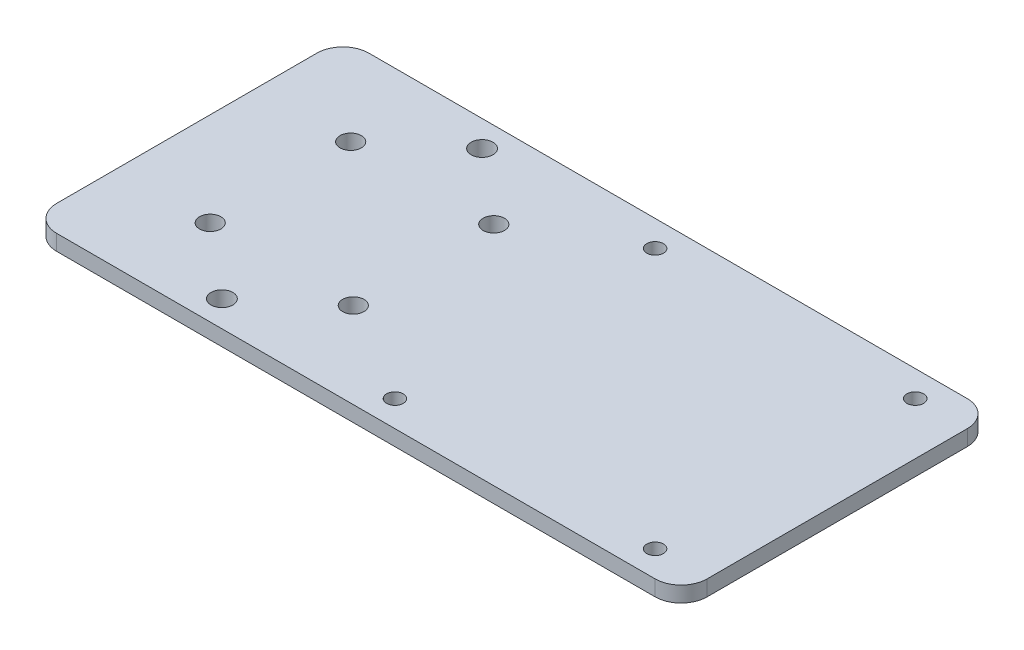
ISO-10303-21;
HEADER;
FILE_DESCRIPTION(('STEP AP214'),'2;1');
FILE_NAME('part.step','',(''),(''),'','','');
FILE_SCHEMA(('AUTOMOTIVE_DESIGN { 1 0 10303 214 1 1 1 1 }'));
ENDSEC;
DATA;
#1=APPLICATION_CONTEXT('core data for automotive mechanical design processes');
#2=APPLICATION_PROTOCOL_DEFINITION('international standard','automotive_design',2000,#1);
#3=PRODUCT_CONTEXT('',#1,'mechanical');
#4=PRODUCT('Part','Part','',(#3));
#5=PRODUCT_RELATED_PRODUCT_CATEGORY('part','',(#4));
#6=PRODUCT_DEFINITION_FORMATION('','',#4);
#7=PRODUCT_DEFINITION_CONTEXT('part definition',#1,'design');
#8=PRODUCT_DEFINITION('design','',#6,#7);
#9=PRODUCT_DEFINITION_SHAPE('','',#8);
#10=(LENGTH_UNIT() NAMED_UNIT(*) SI_UNIT(.MILLI.,.METRE.));
#11=(NAMED_UNIT(*) PLANE_ANGLE_UNIT() SI_UNIT($,.RADIAN.));
#12=(NAMED_UNIT(*) SI_UNIT($,.STERADIAN.) SOLID_ANGLE_UNIT());
#13=UNCERTAINTY_MEASURE_WITH_UNIT(LENGTH_MEASURE(1.E-05),#10,'distance_accuracy_value','');
#14=(GEOMETRIC_REPRESENTATION_CONTEXT(3) GLOBAL_UNCERTAINTY_ASSIGNED_CONTEXT((#13)) GLOBAL_UNIT_ASSIGNED_CONTEXT((#10,
#11,#12)) REPRESENTATION_CONTEXT('',''));
#15=CARTESIAN_POINT('',(0.,0.,0.));
#16=DIRECTION('',(0.,0.,1.));
#17=DIRECTION('',(1.,0.,0.));
#18=AXIS2_PLACEMENT_3D('',#15,#16,#17);
#19=CARTESIAN_POINT('',(-121.441364285791,3.,0.));
#20=DIRECTION('',(1.,0.,0.));
#21=DIRECTION('',(0.,0.,-1.));
#22=AXIS2_PLACEMENT_3D('',#19,#20,#21);
#23=PLANE('',#22);
#24=DIRECTION('',(0.,0.,1.));
#25=VECTOR('',#24,1.);
#26=CARTESIAN_POINT('',(-121.441364285791,3.,0.));
#27=LINE('',#26,#25);
#28=CARTESIAN_POINT('',(-121.441364285791,3.,-97.5));
#29=VERTEX_POINT('',#28);
#30=CARTESIAN_POINT('',(-121.441364285791,3.,-47.5));
#31=VERTEX_POINT('',#30);
#32=EDGE_CURVE('E128',#29,#31,#27,.T.);
#33=ORIENTED_EDGE('',*,*,#32,.T.);
#34=DIRECTION('',(0.,-1.,0.));
#35=VECTOR('',#34,1.);
#36=CARTESIAN_POINT('',(-121.441364285791,0.,-47.5));
#37=LINE('',#36,#35);
#38=CARTESIAN_POINT('',(-121.441364285791,0.,-47.5));
#39=VERTEX_POINT('',#38);
#40=EDGE_CURVE('E155',#31,#39,#37,.T.);
#41=ORIENTED_EDGE('',*,*,#40,.T.);
#42=DIRECTION('',(0.,0.,1.));
#43=VECTOR('',#42,1.);
#44=CARTESIAN_POINT('',(-121.441364285791,0.,0.));
#45=LINE('',#44,#43);
#46=CARTESIAN_POINT('',(-121.441364285791,0.,-97.5));
#47=VERTEX_POINT('',#46);
#48=EDGE_CURVE('E160',#47,#39,#45,.T.);
#49=ORIENTED_EDGE('',*,*,#48,.F.);
#50=DIRECTION('',(0.,-1.,0.));
#51=VECTOR('',#50,1.);
#52=CARTESIAN_POINT('',(-121.441364285791,3.,-97.5));
#53=LINE('',#52,#51);
#54=EDGE_CURVE('E153',#47,#29,#53,.F.);
#55=ORIENTED_EDGE('',*,*,#54,.T.);
#56=EDGE_LOOP('',(#33,#41,#49,#55));
#57=FACE_BOUND('',#56,.T.);
#58=ADVANCED_FACE('F36',(#57),#23,.T.);
#59=CARTESIAN_POINT('',(0.,3.,-102.5));
#60=DIRECTION('',(0.,0.,-1.));
#61=DIRECTION('',(-1.,0.,0.));
#62=AXIS2_PLACEMENT_3D('',#59,#60,#61);
#63=PLANE('',#62);
#64=DIRECTION('',(1.,0.,0.));
#65=VECTOR('',#64,1.);
#66=CARTESIAN_POINT('',(0.,3.,-102.5));
#67=LINE('',#66,#65);
#68=CARTESIAN_POINT('',(-241.441364285791,3.,-102.5));
#69=VERTEX_POINT('',#68);
#70=CARTESIAN_POINT('',(-126.441364285791,3.,-102.5));
#71=VERTEX_POINT('',#70);
#72=EDGE_CURVE('E132',#69,#71,#67,.T.);
#73=ORIENTED_EDGE('',*,*,#72,.T.);
#74=DIRECTION('',(0.,-1.,0.));
#75=VECTOR('',#74,1.);
#76=CARTESIAN_POINT('',(-126.441364285791,3.,-102.5));
#77=LINE('',#76,#75);
#78=CARTESIAN_POINT('',(-126.441364285791,0.,-102.5));
#79=VERTEX_POINT('',#78);
#80=EDGE_CURVE('E11',#71,#79,#77,.T.);
#81=ORIENTED_EDGE('',*,*,#80,.T.);
#82=DIRECTION('',(1.,0.,0.));
#83=VECTOR('',#82,1.);
#84=CARTESIAN_POINT('',(0.,0.,-102.5));
#85=LINE('',#84,#83);
#86=CARTESIAN_POINT('',(-241.441364285791,0.,-102.5));
#87=VERTEX_POINT('',#86);
#88=EDGE_CURVE('E134',#87,#79,#85,.T.);
#89=ORIENTED_EDGE('',*,*,#88,.F.);
#90=DIRECTION('',(0.,-1.,0.));
#91=VECTOR('',#90,1.);
#92=CARTESIAN_POINT('',(-241.441364285791,3.,-102.5));
#93=LINE('',#92,#91);
#94=EDGE_CURVE('E44',#87,#69,#93,.F.);
#95=ORIENTED_EDGE('',*,*,#94,.T.);
#96=EDGE_LOOP('',(#73,#81,#89,#95));
#97=FACE_BOUND('',#96,.T.);
#98=ADVANCED_FACE('F269',(#97),#63,.T.);
#99=CARTESIAN_POINT('',(-246.441364285791,3.,0.));
#100=DIRECTION('',(-1.,0.,0.));
#101=DIRECTION('',(0.,0.,1.));
#102=AXIS2_PLACEMENT_3D('',#99,#100,#101);
#103=PLANE('',#102);
#104=DIRECTION('',(0.,0.,-1.));
#105=VECTOR('',#104,1.);
#106=CARTESIAN_POINT('',(-246.441364285791,0.,0.));
#107=LINE('',#106,#105);
#108=CARTESIAN_POINT('',(-246.441364285791,0.,-47.5));
#109=VERTEX_POINT('',#108);
#110=CARTESIAN_POINT('',(-246.441364285791,0.,-97.5));
#111=VERTEX_POINT('',#110);
#112=EDGE_CURVE('E129',#109,#111,#107,.T.);
#113=ORIENTED_EDGE('',*,*,#112,.F.);
#114=DIRECTION('',(0.,-1.,0.));
#115=VECTOR('',#114,1.);
#116=CARTESIAN_POINT('',(-246.441364285791,3.,-47.5));
#117=LINE('',#116,#115);
#118=CARTESIAN_POINT('',(-246.441364285791,3.,-47.5));
#119=VERTEX_POINT('',#118);
#120=EDGE_CURVE('E107',#109,#119,#117,.F.);
#121=ORIENTED_EDGE('',*,*,#120,.T.);
#122=DIRECTION('',(0.,0.,-1.));
#123=VECTOR('',#122,1.);
#124=CARTESIAN_POINT('',(-246.441364285791,3.,0.));
#125=LINE('',#124,#123);
#126=CARTESIAN_POINT('',(-246.441364285791,3.,-97.5));
#127=VERTEX_POINT('',#126);
#128=EDGE_CURVE('E172',#119,#127,#125,.T.);
#129=ORIENTED_EDGE('',*,*,#128,.T.);
#130=DIRECTION('',(0.,-1.,0.));
#131=VECTOR('',#130,1.);
#132=CARTESIAN_POINT('',(-246.441364285791,3.,-97.5));
#133=LINE('',#132,#131);
#134=EDGE_CURVE('E112',#127,#111,#133,.T.);
#135=ORIENTED_EDGE('',*,*,#134,.T.);
#136=EDGE_LOOP('',(#113,#121,#129,#135));
#137=FACE_BOUND('',#136,.T.);
#138=ADVANCED_FACE('F267',(#137),#103,.T.);
#139=CARTESIAN_POINT('',(0.,3.,-42.5));
#140=DIRECTION('',(0.,0.,-1.));
#141=DIRECTION('',(-1.,0.,0.));
#142=AXIS2_PLACEMENT_3D('',#139,#140,#141);
#143=PLANE('',#142);
#144=DIRECTION('',(1.,0.,0.));
#145=VECTOR('',#144,1.);
#146=CARTESIAN_POINT('',(0.,3.,-42.5));
#147=LINE('',#146,#145);
#148=CARTESIAN_POINT('',(-241.441364285791,3.,-42.5));
#149=VERTEX_POINT('',#148);
#150=CARTESIAN_POINT('',(-126.441364285791,3.,-42.5));
#151=VERTEX_POINT('',#150);
#152=EDGE_CURVE('E122',#149,#151,#147,.T.);
#153=ORIENTED_EDGE('',*,*,#152,.F.);
#154=DIRECTION('',(0.,-1.,0.));
#155=VECTOR('',#154,1.);
#156=CARTESIAN_POINT('',(-241.441364285791,0.,-42.5));
#157=LINE('',#156,#155);
#158=CARTESIAN_POINT('',(-241.441364285791,0.,-42.5));
#159=VERTEX_POINT('',#158);
#160=EDGE_CURVE('E106',#149,#159,#157,.T.);
#161=ORIENTED_EDGE('',*,*,#160,.T.);
#162=DIRECTION('',(1.,0.,0.));
#163=VECTOR('',#162,1.);
#164=CARTESIAN_POINT('',(0.,0.,-42.5));
#165=LINE('',#164,#163);
#166=CARTESIAN_POINT('',(-126.441364285791,0.,-42.5));
#167=VERTEX_POINT('',#166);
#168=EDGE_CURVE('E119',#159,#167,#165,.T.);
#169=ORIENTED_EDGE('',*,*,#168,.T.);
#170=DIRECTION('',(0.,-1.,0.));
#171=VECTOR('',#170,1.);
#172=CARTESIAN_POINT('',(-126.441364285791,3.,-42.5));
#173=LINE('',#172,#171);
#174=EDGE_CURVE('E124',#167,#151,#173,.F.);
#175=ORIENTED_EDGE('',*,*,#174,.T.);
#176=EDGE_LOOP('',(#153,#161,#169,#175));
#177=FACE_BOUND('',#176,.T.);
#178=ADVANCED_FACE('F118',(#177),#143,.F.);
#179=CARTESIAN_POINT('',(0.,3.,0.));
#180=DIRECTION('',(0.,1.,0.));
#181=DIRECTION('',(0.,0.,1.));
#182=AXIS2_PLACEMENT_3D('',#179,#180,#181);
#183=PLANE('',#182);
#184=CARTESIAN_POINT('',(-131.441364285791,3.,-97.5));
#185=DIRECTION('',(0.,1.,0.));
#186=DIRECTION('',(0.,0.,1.));
#187=AXIS2_PLACEMENT_3D('',#184,#185,#186);
#188=CIRCLE('',#187,1.60000000000002);
#189=CARTESIAN_POINT('',(-131.441364285791,3.,-95.9));
#190=VERTEX_POINT('',#189);
#191=EDGE_CURVE('E227',#190,#190,#188,.T.);
#192=ORIENTED_EDGE('',*,*,#191,.F.);
#193=EDGE_LOOP('',(#192));
#194=FACE_BOUND('',#193,.T.);
#195=CARTESIAN_POINT('',(-131.441364285791,3.,-47.5));
#196=DIRECTION('',(0.,1.,0.));
#197=DIRECTION('',(0.,0.,-1.));
#198=AXIS2_PLACEMENT_3D('',#195,#196,#197);
#199=CIRCLE('',#198,1.60000000000002);
#200=CARTESIAN_POINT('',(-131.441364285791,3.,-49.1));
#201=VERTEX_POINT('',#200);
#202=EDGE_CURVE('E221',#201,#201,#199,.T.);
#203=ORIENTED_EDGE('',*,*,#202,.F.);
#204=EDGE_LOOP('',(#203));
#205=FACE_BOUND('',#204,.T.);
#206=CARTESIAN_POINT('',(-181.441364285791,3.,-47.5));
#207=DIRECTION('',(0.,1.,0.));
#208=DIRECTION('',(0.,0.,-1.));
#209=AXIS2_PLACEMENT_3D('',#206,#207,#208);
#210=CIRCLE('',#209,1.59999999999999);
#211=CARTESIAN_POINT('',(-181.441364285791,3.,-49.1));
#212=VERTEX_POINT('',#211);
#213=EDGE_CURVE('E215',#212,#212,#210,.T.);
#214=ORIENTED_EDGE('',*,*,#213,.F.);
#215=EDGE_LOOP('',(#214));
#216=FACE_BOUND('',#215,.T.);
#217=CARTESIAN_POINT('',(-181.441364285791,3.,-97.5));
#218=DIRECTION('',(0.,1.,0.));
#219=DIRECTION('',(0.,0.,1.));
#220=AXIS2_PLACEMENT_3D('',#217,#218,#219);
#221=CIRCLE('',#220,1.59999999999999);
#222=CARTESIAN_POINT('',(-181.441364285791,3.,-95.9));
#223=VERTEX_POINT('',#222);
#224=EDGE_CURVE('E209',#223,#223,#221,.T.);
#225=ORIENTED_EDGE('',*,*,#224,.F.);
#226=EDGE_LOOP('',(#225));
#227=FACE_BOUND('',#226,.T.);
#228=CARTESIAN_POINT('',(-214.691364285791,3.,-47.5000000000002));
#229=DIRECTION('',(0.,1.,0.));
#230=DIRECTION('',(0.,0.,-1.));
#231=AXIS2_PLACEMENT_3D('',#228,#229,#230);
#232=CIRCLE('',#231,2.09999999999999);
#233=CARTESIAN_POINT('',(-214.691364285791,3.,-49.6000000000002));
#234=VERTEX_POINT('',#233);
#235=EDGE_CURVE('E191',#234,#234,#232,.T.);
#236=ORIENTED_EDGE('',*,*,#235,.F.);
#237=EDGE_LOOP('',(#236));
#238=FACE_BOUND('',#237,.T.);
#239=CARTESIAN_POINT('',(-214.691364285791,3.,-97.4999999999998));
#240=DIRECTION('',(0.,1.,0.));
#241=DIRECTION('',(0.,0.,1.));
#242=AXIS2_PLACEMENT_3D('',#239,#240,#241);
#243=CIRCLE('',#242,2.09999999999999);
#244=CARTESIAN_POINT('',(-214.691364285791,3.,-95.3999999999998));
#245=VERTEX_POINT('',#244);
#246=EDGE_CURVE('E198',#245,#245,#243,.T.);
#247=ORIENTED_EDGE('',*,*,#246,.F.);
#248=EDGE_LOOP('',(#247));
#249=FACE_BOUND('',#248,.T.);
#250=CARTESIAN_POINT('',(-200.941364285791,3.,-59.));
#251=DIRECTION('',(0.,1.,0.));
#252=DIRECTION('',(0.,0.,-1.));
#253=AXIS2_PLACEMENT_3D('',#250,#251,#252);
#254=CIRCLE('',#253,2.04999999999999);
#255=CARTESIAN_POINT('',(-200.941364285791,3.,-61.05));
#256=VERTEX_POINT('',#255);
#257=EDGE_CURVE('E204',#256,#256,#254,.T.);
#258=ORIENTED_EDGE('',*,*,#257,.F.);
#259=EDGE_LOOP('',(#258));
#260=FACE_BOUND('',#259,.T.);
#261=CARTESIAN_POINT('',(-200.941364285791,3.,-86.));
#262=DIRECTION('',(0.,1.,0.));
#263=DIRECTION('',(0.,0.,1.));
#264=AXIS2_PLACEMENT_3D('',#261,#262,#263);
#265=CIRCLE('',#264,2.04999999999999);
#266=CARTESIAN_POINT('',(-200.941364285791,3.,-83.95));
#267=VERTEX_POINT('',#266);
#268=EDGE_CURVE('E179',#267,#267,#265,.T.);
#269=ORIENTED_EDGE('',*,*,#268,.F.);
#270=EDGE_LOOP('',(#269));
#271=FACE_BOUND('',#270,.T.);
#272=CARTESIAN_POINT('',(-228.441364285791,3.,-59.));
#273=DIRECTION('',(0.,1.,0.));
#274=DIRECTION('',(0.,0.,1.));
#275=AXIS2_PLACEMENT_3D('',#272,#273,#274);
#276=CIRCLE('',#275,2.04999999999999);
#277=CARTESIAN_POINT('',(-228.441364285791,3.,-56.95));
#278=VERTEX_POINT('',#277);
#279=EDGE_CURVE('E186',#278,#278,#276,.T.);
#280=ORIENTED_EDGE('',*,*,#279,.F.);
#281=EDGE_LOOP('',(#280));
#282=FACE_BOUND('',#281,.T.);
#283=CARTESIAN_POINT('',(-228.441364285791,3.,-86.));
#284=DIRECTION('',(0.,1.,0.));
#285=DIRECTION('',(0.,0.,1.));
#286=AXIS2_PLACEMENT_3D('',#283,#284,#285);
#287=CIRCLE('',#286,2.04999999999999);
#288=CARTESIAN_POINT('',(-228.441364285791,3.,-83.95));
#289=VERTEX_POINT('',#288);
#290=EDGE_CURVE('E168',#289,#289,#287,.T.);
#291=ORIENTED_EDGE('',*,*,#290,.F.);
#292=EDGE_LOOP('',(#291));
#293=FACE_BOUND('',#292,.T.);
#294=ORIENTED_EDGE('',*,*,#128,.F.);
#295=CARTESIAN_POINT('',(-241.441364285791,3.,-47.5));
#296=DIRECTION('',(0.,1.,0.));
#297=DIRECTION('',(0.,0.,1.));
#298=AXIS2_PLACEMENT_3D('',#295,#296,#297);
#299=CIRCLE('',#298,5.);
#300=EDGE_CURVE('E151',#119,#149,#299,.T.);
#301=ORIENTED_EDGE('',*,*,#300,.T.);
#302=ORIENTED_EDGE('',*,*,#152,.T.);
#303=CARTESIAN_POINT('',(-126.441364285791,3.,-47.5));
#304=DIRECTION('',(0.,1.,0.));
#305=DIRECTION('',(0.,0.,1.));
#306=AXIS2_PLACEMENT_3D('',#303,#304,#305);
#307=CIRCLE('',#306,5.);
#308=EDGE_CURVE('E149',#151,#31,#307,.T.);
#309=ORIENTED_EDGE('',*,*,#308,.T.);
#310=ORIENTED_EDGE('',*,*,#32,.F.);
#311=CARTESIAN_POINT('',(-126.441364285791,3.,-97.5));
#312=DIRECTION('',(0.,1.,0.));
#313=DIRECTION('',(0.,0.,1.));
#314=AXIS2_PLACEMENT_3D('',#311,#312,#313);
#315=CIRCLE('',#314,5.);
#316=EDGE_CURVE('E51',#29,#71,#315,.T.);
#317=ORIENTED_EDGE('',*,*,#316,.T.);
#318=ORIENTED_EDGE('',*,*,#72,.F.);
#319=CARTESIAN_POINT('',(-241.441364285791,3.,-97.5));
#320=DIRECTION('',(0.,1.,0.));
#321=DIRECTION('',(0.,0.,1.));
#322=AXIS2_PLACEMENT_3D('',#319,#320,#321);
#323=CIRCLE('',#322,5.);
#324=EDGE_CURVE('E146',#69,#127,#323,.T.);
#325=ORIENTED_EDGE('',*,*,#324,.T.);
#326=EDGE_LOOP('',(#294,#301,#302,#309,#310,#317,#318,#325));
#327=FACE_BOUND('',#326,.T.);
#328=ADVANCED_FACE('F242',(#194,#205,#216,#227,#238,#249,#260,#271,#282,#293,#327),#183,.T.);
#329=CARTESIAN_POINT('',(0.,0.,0.));
#330=DIRECTION('',(0.,1.,0.));
#331=DIRECTION('',(0.,0.,1.));
#332=AXIS2_PLACEMENT_3D('',#329,#330,#331);
#333=PLANE('',#332);
#334=CARTESIAN_POINT('',(-131.441364285791,0.,-97.5));
#335=DIRECTION('',(0.,1.,0.));
#336=DIRECTION('',(0.,0.,1.));
#337=AXIS2_PLACEMENT_3D('',#334,#335,#336);
#338=CIRCLE('',#337,1.60000000000002);
#339=CARTESIAN_POINT('',(-131.441364285791,0.,-95.9));
#340=VERTEX_POINT('',#339);
#341=EDGE_CURVE('E212',#340,#340,#338,.T.);
#342=ORIENTED_EDGE('',*,*,#341,.T.);
#343=EDGE_LOOP('',(#342));
#344=FACE_BOUND('',#343,.T.);
#345=CARTESIAN_POINT('',(-131.441364285791,0.,-47.5));
#346=DIRECTION('',(0.,1.,0.));
#347=DIRECTION('',(0.,0.,-1.));
#348=AXIS2_PLACEMENT_3D('',#345,#346,#347);
#349=CIRCLE('',#348,1.60000000000002);
#350=CARTESIAN_POINT('',(-131.441364285791,0.,-49.1));
#351=VERTEX_POINT('',#350);
#352=EDGE_CURVE('E224',#351,#351,#349,.T.);
#353=ORIENTED_EDGE('',*,*,#352,.T.);
#354=EDGE_LOOP('',(#353));
#355=FACE_BOUND('',#354,.T.);
#356=CARTESIAN_POINT('',(-181.441364285791,0.,-47.5));
#357=DIRECTION('',(0.,1.,0.));
#358=DIRECTION('',(0.,0.,-1.));
#359=AXIS2_PLACEMENT_3D('',#356,#357,#358);
#360=CIRCLE('',#359,1.59999999999999);
#361=CARTESIAN_POINT('',(-181.441364285791,0.,-49.1));
#362=VERTEX_POINT('',#361);
#363=EDGE_CURVE('E218',#362,#362,#360,.T.);
#364=ORIENTED_EDGE('',*,*,#363,.T.);
#365=EDGE_LOOP('',(#364));
#366=FACE_BOUND('',#365,.T.);
#367=CARTESIAN_POINT('',(-181.441364285791,0.,-97.5));
#368=DIRECTION('',(0.,1.,0.));
#369=DIRECTION('',(0.,0.,1.));
#370=AXIS2_PLACEMENT_3D('',#367,#368,#369);
#371=CIRCLE('',#370,1.59999999999999);
#372=CARTESIAN_POINT('',(-181.441364285791,0.,-95.9));
#373=VERTEX_POINT('',#372);
#374=EDGE_CURVE('E195',#373,#373,#371,.T.);
#375=ORIENTED_EDGE('',*,*,#374,.T.);
#376=EDGE_LOOP('',(#375));
#377=FACE_BOUND('',#376,.T.);
#378=CARTESIAN_POINT('',(-214.691364285791,0.,-47.5000000000002));
#379=DIRECTION('',(0.,1.,0.));
#380=DIRECTION('',(0.,0.,-1.));
#381=AXIS2_PLACEMENT_3D('',#378,#379,#380);
#382=CIRCLE('',#381,2.09999999999999);
#383=CARTESIAN_POINT('',(-214.691364285791,0.,-49.6000000000002));
#384=VERTEX_POINT('',#383);
#385=EDGE_CURVE('E194',#384,#384,#382,.T.);
#386=ORIENTED_EDGE('',*,*,#385,.T.);
#387=EDGE_LOOP('',(#386));
#388=FACE_BOUND('',#387,.T.);
#389=CARTESIAN_POINT('',(-214.691364285791,0.,-97.4999999999998));
#390=DIRECTION('',(0.,1.,0.));
#391=DIRECTION('',(0.,0.,1.));
#392=AXIS2_PLACEMENT_3D('',#389,#390,#391);
#393=CIRCLE('',#392,2.09999999999999);
#394=CARTESIAN_POINT('',(-214.691364285791,0.,-95.3999999999998));
#395=VERTEX_POINT('',#394);
#396=EDGE_CURVE('E201',#395,#395,#393,.T.);
#397=ORIENTED_EDGE('',*,*,#396,.T.);
#398=EDGE_LOOP('',(#397));
#399=FACE_BOUND('',#398,.T.);
#400=CARTESIAN_POINT('',(-200.941364285791,0.,-59.));
#401=DIRECTION('',(0.,1.,0.));
#402=DIRECTION('',(0.,0.,-1.));
#403=AXIS2_PLACEMENT_3D('',#400,#401,#402);
#404=CIRCLE('',#403,2.04999999999999);
#405=CARTESIAN_POINT('',(-200.941364285791,0.,-61.05));
#406=VERTEX_POINT('',#405);
#407=EDGE_CURVE('E183',#406,#406,#404,.T.);
#408=ORIENTED_EDGE('',*,*,#407,.T.);
#409=EDGE_LOOP('',(#408));
#410=FACE_BOUND('',#409,.T.);
#411=CARTESIAN_POINT('',(-200.941364285791,0.,-86.));
#412=DIRECTION('',(0.,1.,0.));
#413=DIRECTION('',(0.,0.,1.));
#414=AXIS2_PLACEMENT_3D('',#411,#412,#413);
#415=CIRCLE('',#414,2.04999999999999);
#416=CARTESIAN_POINT('',(-200.941364285791,0.,-83.95));
#417=VERTEX_POINT('',#416);
#418=EDGE_CURVE('E182',#417,#417,#415,.T.);
#419=ORIENTED_EDGE('',*,*,#418,.T.);
#420=EDGE_LOOP('',(#419));
#421=FACE_BOUND('',#420,.T.);
#422=CARTESIAN_POINT('',(-228.441364285791,0.,-59.));
#423=DIRECTION('',(0.,1.,0.));
#424=DIRECTION('',(0.,0.,1.));
#425=AXIS2_PLACEMENT_3D('',#422,#423,#424);
#426=CIRCLE('',#425,2.04999999999999);
#427=CARTESIAN_POINT('',(-228.441364285791,0.,-56.95));
#428=VERTEX_POINT('',#427);
#429=EDGE_CURVE('E177',#428,#428,#426,.T.);
#430=ORIENTED_EDGE('',*,*,#429,.T.);
#431=EDGE_LOOP('',(#430));
#432=FACE_BOUND('',#431,.T.);
#433=CARTESIAN_POINT('',(-228.441364285791,0.,-86.));
#434=DIRECTION('',(0.,1.,0.));
#435=DIRECTION('',(0.,0.,1.));
#436=AXIS2_PLACEMENT_3D('',#433,#434,#435);
#437=CIRCLE('',#436,2.04999999999999);
#438=CARTESIAN_POINT('',(-228.441364285791,0.,-83.95));
#439=VERTEX_POINT('',#438);
#440=EDGE_CURVE('E165',#439,#439,#437,.T.);
#441=ORIENTED_EDGE('',*,*,#440,.T.);
#442=EDGE_LOOP('',(#441));
#443=FACE_BOUND('',#442,.T.);
#444=ORIENTED_EDGE('',*,*,#168,.F.);
#445=CARTESIAN_POINT('',(-241.441364285791,0.,-47.5));
#446=DIRECTION('',(0.,1.,0.));
#447=DIRECTION('',(0.,0.,1.));
#448=AXIS2_PLACEMENT_3D('',#445,#446,#447);
#449=CIRCLE('',#448,5.);
#450=EDGE_CURVE('E102',#159,#109,#449,.F.);
#451=ORIENTED_EDGE('',*,*,#450,.T.);
#452=ORIENTED_EDGE('',*,*,#112,.T.);
#453=CARTESIAN_POINT('',(-241.441364285791,0.,-97.5));
#454=DIRECTION('',(0.,1.,0.));
#455=DIRECTION('',(0.,0.,1.));
#456=AXIS2_PLACEMENT_3D('',#453,#454,#455);
#457=CIRCLE('',#456,5.);
#458=EDGE_CURVE('E123',#111,#87,#457,.F.);
#459=ORIENTED_EDGE('',*,*,#458,.T.);
#460=ORIENTED_EDGE('',*,*,#88,.T.);
#461=CARTESIAN_POINT('',(-126.441364285791,0.,-97.5));
#462=DIRECTION('',(0.,1.,0.));
#463=DIRECTION('',(0.,0.,1.));
#464=AXIS2_PLACEMENT_3D('',#461,#462,#463);
#465=CIRCLE('',#464,5.);
#466=EDGE_CURVE('E140',#79,#47,#465,.F.);
#467=ORIENTED_EDGE('',*,*,#466,.T.);
#468=ORIENTED_EDGE('',*,*,#48,.T.);
#469=CARTESIAN_POINT('',(-126.441364285791,0.,-47.5));
#470=DIRECTION('',(0.,1.,0.));
#471=DIRECTION('',(0.,0.,1.));
#472=AXIS2_PLACEMENT_3D('',#469,#470,#471);
#473=CIRCLE('',#472,5.);
#474=EDGE_CURVE('E113',#39,#167,#473,.F.);
#475=ORIENTED_EDGE('',*,*,#474,.T.);
#476=EDGE_LOOP('',(#444,#451,#452,#459,#460,#467,#468,#475));
#477=FACE_BOUND('',#476,.T.);
#478=ADVANCED_FACE('F126',(#344,#355,#366,#377,#388,#399,#410,#421,#432,#443,#477),#333,.F.);
#479=CARTESIAN_POINT('',(-228.441364285791,0.,-86.));
#480=DIRECTION('',(0.,1.,0.));
#481=DIRECTION('',(0.,0.,1.));
#482=AXIS2_PLACEMENT_3D('',#479,#480,#481);
#483=CYLINDRICAL_SURFACE('',#482,2.04999999999999);
#484=ORIENTED_EDGE('',*,*,#440,.F.);
#485=EDGE_LOOP('',(#484));
#486=FACE_BOUND('',#485,.T.);
#487=ORIENTED_EDGE('',*,*,#290,.T.);
#488=EDGE_LOOP('',(#487));
#489=FACE_BOUND('',#488,.T.);
#490=ADVANCED_FACE('F293',(#486,#489),#483,.F.);
#491=CARTESIAN_POINT('',(-228.441364285791,0.,-59.));
#492=DIRECTION('',(0.,1.,0.));
#493=DIRECTION('',(0.,0.,1.));
#494=AXIS2_PLACEMENT_3D('',#491,#492,#493);
#495=CYLINDRICAL_SURFACE('',#494,2.04999999999999);
#496=ORIENTED_EDGE('',*,*,#429,.F.);
#497=EDGE_LOOP('',(#496));
#498=FACE_BOUND('',#497,.T.);
#499=ORIENTED_EDGE('',*,*,#279,.T.);
#500=EDGE_LOOP('',(#499));
#501=FACE_BOUND('',#500,.T.);
#502=ADVANCED_FACE('F297',(#498,#501),#495,.F.);
#503=CARTESIAN_POINT('',(-200.941364285791,0.,-86.));
#504=DIRECTION('',(0.,1.,0.));
#505=DIRECTION('',(0.,0.,1.));
#506=AXIS2_PLACEMENT_3D('',#503,#504,#505);
#507=CYLINDRICAL_SURFACE('',#506,2.04999999999999);
#508=ORIENTED_EDGE('',*,*,#418,.F.);
#509=EDGE_LOOP('',(#508));
#510=FACE_BOUND('',#509,.T.);
#511=ORIENTED_EDGE('',*,*,#268,.T.);
#512=EDGE_LOOP('',(#511));
#513=FACE_BOUND('',#512,.T.);
#514=ADVANCED_FACE('F299',(#510,#513),#507,.F.);
#515=CARTESIAN_POINT('',(-200.941364285791,0.,-59.));
#516=DIRECTION('',(0.,1.,0.));
#517=DIRECTION('',(0.,0.,1.));
#518=AXIS2_PLACEMENT_3D('',#515,#516,#517);
#519=CYLINDRICAL_SURFACE('',#518,2.04999999999999);
#520=ORIENTED_EDGE('',*,*,#407,.F.);
#521=EDGE_LOOP('',(#520));
#522=FACE_BOUND('',#521,.T.);
#523=ORIENTED_EDGE('',*,*,#257,.T.);
#524=EDGE_LOOP('',(#523));
#525=FACE_BOUND('',#524,.T.);
#526=ADVANCED_FACE('F302',(#522,#525),#519,.F.);
#527=CARTESIAN_POINT('',(-214.691364285791,0.,-97.4999999999998));
#528=DIRECTION('',(0.,1.,0.));
#529=DIRECTION('',(0.,0.,1.));
#530=AXIS2_PLACEMENT_3D('',#527,#528,#529);
#531=CYLINDRICAL_SURFACE('',#530,2.09999999999999);
#532=ORIENTED_EDGE('',*,*,#396,.F.);
#533=EDGE_LOOP('',(#532));
#534=FACE_BOUND('',#533,.T.);
#535=ORIENTED_EDGE('',*,*,#246,.T.);
#536=EDGE_LOOP('',(#535));
#537=FACE_BOUND('',#536,.T.);
#538=ADVANCED_FACE('F311',(#534,#537),#531,.F.);
#539=CARTESIAN_POINT('',(-214.691364285791,0.,-47.5000000000002));
#540=DIRECTION('',(0.,1.,0.));
#541=DIRECTION('',(0.,0.,1.));
#542=AXIS2_PLACEMENT_3D('',#539,#540,#541);
#543=CYLINDRICAL_SURFACE('',#542,2.09999999999999);
#544=ORIENTED_EDGE('',*,*,#385,.F.);
#545=EDGE_LOOP('',(#544));
#546=FACE_BOUND('',#545,.T.);
#547=ORIENTED_EDGE('',*,*,#235,.T.);
#548=EDGE_LOOP('',(#547));
#549=FACE_BOUND('',#548,.T.);
#550=ADVANCED_FACE('F307',(#546,#549),#543,.F.);
#551=CARTESIAN_POINT('',(-181.441364285791,0.,-97.5));
#552=DIRECTION('',(0.,1.,0.));
#553=DIRECTION('',(0.,0.,1.));
#554=AXIS2_PLACEMENT_3D('',#551,#552,#553);
#555=CYLINDRICAL_SURFACE('',#554,1.59999999999999);
#556=ORIENTED_EDGE('',*,*,#374,.F.);
#557=EDGE_LOOP('',(#556));
#558=FACE_BOUND('',#557,.T.);
#559=ORIENTED_EDGE('',*,*,#224,.T.);
#560=EDGE_LOOP('',(#559));
#561=FACE_BOUND('',#560,.T.);
#562=ADVANCED_FACE('F310',(#558,#561),#555,.F.);
#563=CARTESIAN_POINT('',(-181.441364285791,0.,-47.5));
#564=DIRECTION('',(0.,1.,0.));
#565=DIRECTION('',(0.,0.,1.));
#566=AXIS2_PLACEMENT_3D('',#563,#564,#565);
#567=CYLINDRICAL_SURFACE('',#566,1.59999999999999);
#568=ORIENTED_EDGE('',*,*,#363,.F.);
#569=EDGE_LOOP('',(#568));
#570=FACE_BOUND('',#569,.T.);
#571=ORIENTED_EDGE('',*,*,#213,.T.);
#572=EDGE_LOOP('',(#571));
#573=FACE_BOUND('',#572,.T.);
#574=ADVANCED_FACE('F321',(#570,#573),#567,.F.);
#575=CARTESIAN_POINT('',(-131.441364285791,0.,-47.5));
#576=DIRECTION('',(0.,1.,0.));
#577=DIRECTION('',(0.,0.,1.));
#578=AXIS2_PLACEMENT_3D('',#575,#576,#577);
#579=CYLINDRICAL_SURFACE('',#578,1.60000000000002);
#580=ORIENTED_EDGE('',*,*,#352,.F.);
#581=EDGE_LOOP('',(#580));
#582=FACE_BOUND('',#581,.T.);
#583=ORIENTED_EDGE('',*,*,#202,.T.);
#584=EDGE_LOOP('',(#583));
#585=FACE_BOUND('',#584,.T.);
#586=ADVANCED_FACE('F238',(#582,#585),#579,.F.);
#587=CARTESIAN_POINT('',(-131.441364285791,0.,-97.5));
#588=DIRECTION('',(0.,1.,0.));
#589=DIRECTION('',(0.,0.,1.));
#590=AXIS2_PLACEMENT_3D('',#587,#588,#589);
#591=CYLINDRICAL_SURFACE('',#590,1.60000000000002);
#592=ORIENTED_EDGE('',*,*,#341,.F.);
#593=EDGE_LOOP('',(#592));
#594=FACE_BOUND('',#593,.T.);
#595=ORIENTED_EDGE('',*,*,#191,.T.);
#596=EDGE_LOOP('',(#595));
#597=FACE_BOUND('',#596,.T.);
#598=ADVANCED_FACE('F235',(#594,#597),#591,.F.);
#599=CARTESIAN_POINT('',(-241.441364285791,3.,-47.5));
#600=DIRECTION('',(0.,1.,0.));
#601=DIRECTION('',(0.,0.,1.));
#602=AXIS2_PLACEMENT_3D('',#599,#600,#601);
#603=CYLINDRICAL_SURFACE('',#602,5.);
#604=ORIENTED_EDGE('',*,*,#300,.F.);
#605=ORIENTED_EDGE('',*,*,#120,.F.);
#606=ORIENTED_EDGE('',*,*,#450,.F.);
#607=ORIENTED_EDGE('',*,*,#160,.F.);
#608=EDGE_LOOP('',(#604,#605,#606,#607));
#609=FACE_BOUND('',#608,.T.);
#610=ADVANCED_FACE('F105',(#609),#603,.T.);
#611=CARTESIAN_POINT('',(-126.441364285791,3.,-47.5));
#612=DIRECTION('',(0.,1.,0.));
#613=DIRECTION('',(0.,0.,1.));
#614=AXIS2_PLACEMENT_3D('',#611,#612,#613);
#615=CYLINDRICAL_SURFACE('',#614,5.);
#616=ORIENTED_EDGE('',*,*,#308,.F.);
#617=ORIENTED_EDGE('',*,*,#174,.F.);
#618=ORIENTED_EDGE('',*,*,#474,.F.);
#619=ORIENTED_EDGE('',*,*,#40,.F.);
#620=EDGE_LOOP('',(#616,#617,#618,#619));
#621=FACE_BOUND('',#620,.T.);
#622=ADVANCED_FACE('F273',(#621),#615,.T.);
#623=CARTESIAN_POINT('',(-126.441364285791,3.,-97.5));
#624=DIRECTION('',(0.,-1.,0.));
#625=DIRECTION('',(0.,0.,-1.));
#626=AXIS2_PLACEMENT_3D('',#623,#624,#625);
#627=CYLINDRICAL_SURFACE('',#626,5.);
#628=ORIENTED_EDGE('',*,*,#316,.F.);
#629=ORIENTED_EDGE('',*,*,#54,.F.);
#630=ORIENTED_EDGE('',*,*,#466,.F.);
#631=ORIENTED_EDGE('',*,*,#80,.F.);
#632=EDGE_LOOP('',(#628,#629,#630,#631));
#633=FACE_BOUND('',#632,.T.);
#634=ADVANCED_FACE('F272',(#633),#627,.T.);
#635=CARTESIAN_POINT('',(-241.441364285791,3.,-97.5));
#636=DIRECTION('',(0.,-1.,0.));
#637=DIRECTION('',(0.,0.,-1.));
#638=AXIS2_PLACEMENT_3D('',#635,#636,#637);
#639=CYLINDRICAL_SURFACE('',#638,5.);
#640=ORIENTED_EDGE('',*,*,#324,.F.);
#641=ORIENTED_EDGE('',*,*,#94,.F.);
#642=ORIENTED_EDGE('',*,*,#458,.F.);
#643=ORIENTED_EDGE('',*,*,#134,.F.);
#644=EDGE_LOOP('',(#640,#641,#642,#643));
#645=FACE_BOUND('',#644,.T.);
#646=ADVANCED_FACE('F38',(#645),#639,.T.);
#647=CLOSED_SHELL('',(#58,#98,#138,#178,#328,#478,#490,#502,#514,#526,#538,#550,#562,#574,#586,
#598,#610,#622,#634,#646));
#648=MANIFOLD_SOLID_BREP('B2',#647);
#649=ADVANCED_BREP_SHAPE_REPRESENTATION('',(#18,#648),#14);
#650=SHAPE_DEFINITION_REPRESENTATION(#9,#649);
ENDSEC;
END-ISO-10303-21;
